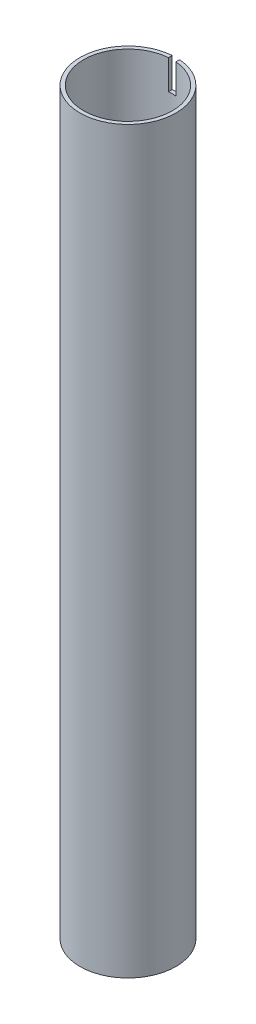
ISO-10303-21;
HEADER;
FILE_DESCRIPTION(('STEP AP214'),'2;1');
FILE_NAME('part.step','',(''),(''),'','','');
FILE_SCHEMA(('AUTOMOTIVE_DESIGN { 1 0 10303 214 1 1 1 1 }'));
ENDSEC;
DATA;
#1=APPLICATION_CONTEXT('core data for automotive mechanical design processes');
#2=APPLICATION_PROTOCOL_DEFINITION('international standard','automotive_design',2000,#1);
#3=PRODUCT_CONTEXT('',#1,'mechanical');
#4=PRODUCT('Part','Part','',(#3));
#5=PRODUCT_RELATED_PRODUCT_CATEGORY('part','',(#4));
#6=PRODUCT_DEFINITION_FORMATION('','',#4);
#7=PRODUCT_DEFINITION_CONTEXT('part definition',#1,'design');
#8=PRODUCT_DEFINITION('design','',#6,#7);
#9=PRODUCT_DEFINITION_SHAPE('','',#8);
#10=(LENGTH_UNIT() NAMED_UNIT(*) SI_UNIT(.MILLI.,.METRE.));
#11=(NAMED_UNIT(*) PLANE_ANGLE_UNIT() SI_UNIT($,.RADIAN.));
#12=(NAMED_UNIT(*) SI_UNIT($,.STERADIAN.) SOLID_ANGLE_UNIT());
#13=UNCERTAINTY_MEASURE_WITH_UNIT(LENGTH_MEASURE(1.E-05),#10,'distance_accuracy_value','');
#14=(GEOMETRIC_REPRESENTATION_CONTEXT(3) GLOBAL_UNCERTAINTY_ASSIGNED_CONTEXT((#13)) GLOBAL_UNIT_ASSIGNED_CONTEXT((#10,
#11,#12)) REPRESENTATION_CONTEXT('',''));
#15=CARTESIAN_POINT('',(0.,0.,0.));
#16=DIRECTION('',(0.,0.,1.));
#17=DIRECTION('',(1.,0.,0.));
#18=AXIS2_PLACEMENT_3D('',#15,#16,#17);
#19=CARTESIAN_POINT('',(0.,250.,0.));
#20=DIRECTION('',(0.,1.,0.));
#21=DIRECTION('',(0.,0.,1.));
#22=AXIS2_PLACEMENT_3D('',#19,#20,#21);
#23=PLANE('',#22);
#24=DIRECTION('',(0.,0.,1.));
#25=VECTOR('',#24,1.);
#26=CARTESIAN_POINT('',(2.49999999999996,250.,-32.501));
#27=LINE('',#26,#25);
#28=CARTESIAN_POINT('',(2.49999999999996,250.,-32.4037034920393));
#29=VERTEX_POINT('',#28);
#30=CARTESIAN_POINT('',(2.49999999999996,250.,-29.8956518577535));
#31=VERTEX_POINT('',#30);
#32=EDGE_CURVE('E137',#29,#31,#27,.T.);
#33=ORIENTED_EDGE('',*,*,#32,.T.);
#34=CARTESIAN_POINT('',(0.,250.,0.));
#35=DIRECTION('',(0.,1.,0.));
#36=DIRECTION('',(0.,0.,1.));
#37=AXIS2_PLACEMENT_3D('',#34,#35,#36);
#38=CIRCLE('',#37,30.);
#39=CARTESIAN_POINT('',(-2.50000000000004,250.,-29.8956518577535));
#40=VERTEX_POINT('',#39);
#41=EDGE_CURVE('E143',#40,#31,#38,.T.);
#42=ORIENTED_EDGE('',*,*,#41,.F.);
#43=DIRECTION('',(0.,0.,1.));
#44=VECTOR('',#43,1.);
#45=CARTESIAN_POINT('',(-2.50000000000004,250.,-32.501));
#46=LINE('',#45,#44);
#47=CARTESIAN_POINT('',(-2.50000000000004,250.,-32.4037034920393));
#48=VERTEX_POINT('',#47);
#49=EDGE_CURVE('E55',#48,#40,#46,.T.);
#50=ORIENTED_EDGE('',*,*,#49,.F.);
#51=CARTESIAN_POINT('',(0.,250.,0.));
#52=DIRECTION('',(0.,1.,0.));
#53=DIRECTION('',(0.,0.,1.));
#54=AXIS2_PLACEMENT_3D('',#51,#52,#53);
#55=CIRCLE('',#54,32.5);
#56=EDGE_CURVE('E149',#48,#29,#55,.T.);
#57=ORIENTED_EDGE('',*,*,#56,.T.);
#58=EDGE_LOOP('',(#33,#42,#50,#57));
#59=FACE_BOUND('',#58,.T.);
#60=ADVANCED_FACE('F33',(#59),#23,.T.);
#61=CARTESIAN_POINT('',(0.,-250.,0.));
#62=DIRECTION('',(0.,1.,0.));
#63=DIRECTION('',(0.,0.,1.));
#64=AXIS2_PLACEMENT_3D('',#61,#62,#63);
#65=PLANE('',#64);
#66=CARTESIAN_POINT('',(0.,-250.,0.));
#67=DIRECTION('',(0.,1.,0.));
#68=DIRECTION('',(0.,0.,1.));
#69=AXIS2_PLACEMENT_3D('',#66,#67,#68);
#70=CIRCLE('',#69,30.);
#71=CARTESIAN_POINT('',(-2.49999999999995,-250.,-29.8956518577535));
#72=VERTEX_POINT('',#71);
#73=CARTESIAN_POINT('',(2.50000000000005,-250.,-29.8956518577535));
#74=VERTEX_POINT('',#73);
#75=EDGE_CURVE('E114',#72,#74,#70,.T.);
#76=ORIENTED_EDGE('',*,*,#75,.T.);
#77=DIRECTION('',(0.,0.,1.));
#78=VECTOR('',#77,1.);
#79=CARTESIAN_POINT('',(2.50000000000005,-250.,-32.501));
#80=LINE('',#79,#78);
#81=CARTESIAN_POINT('',(2.50000000000005,-250.,-32.4037034920393));
#82=VERTEX_POINT('',#81);
#83=EDGE_CURVE('E121',#82,#74,#80,.T.);
#84=ORIENTED_EDGE('',*,*,#83,.F.);
#85=CARTESIAN_POINT('',(0.,-250.,0.));
#86=DIRECTION('',(0.,1.,0.));
#87=DIRECTION('',(0.,0.,1.));
#88=AXIS2_PLACEMENT_3D('',#85,#86,#87);
#89=CIRCLE('',#88,32.5);
#90=CARTESIAN_POINT('',(-2.49999999999995,-250.,-32.4037034920393));
#91=VERTEX_POINT('',#90);
#92=EDGE_CURVE('E146',#91,#82,#89,.T.);
#93=ORIENTED_EDGE('',*,*,#92,.F.);
#94=DIRECTION('',(0.,0.,1.));
#95=VECTOR('',#94,1.);
#96=CARTESIAN_POINT('',(-2.49999999999995,-250.,-32.501));
#97=LINE('',#96,#95);
#98=EDGE_CURVE('E105',#91,#72,#97,.T.);
#99=ORIENTED_EDGE('',*,*,#98,.T.);
#100=EDGE_LOOP('',(#76,#84,#93,#99));
#101=FACE_BOUND('',#100,.T.);
#102=ADVANCED_FACE('F162',(#101),#65,.F.);
#103=CARTESIAN_POINT('',(0.,250.,0.));
#104=DIRECTION('',(0.,-1.,0.));
#105=DIRECTION('',(0.,0.,-1.));
#106=AXIS2_PLACEMENT_3D('',#103,#104,#105);
#107=CYLINDRICAL_SURFACE('',#106,32.5);
#108=ORIENTED_EDGE('',*,*,#92,.T.);
#109=DIRECTION('',(0.,-1.,0.));
#110=VECTOR('',#109,1.);
#111=CARTESIAN_POINT('',(2.50000000000005,250.,-32.4037034920393));
#112=LINE('',#111,#110);
#113=CARTESIAN_POINT('',(2.50000000000005,-230.,-32.4037034920393));
#114=VERTEX_POINT('',#113);
#115=EDGE_CURVE('E115',#114,#82,#112,.T.);
#116=ORIENTED_EDGE('',*,*,#115,.F.);
#117=CARTESIAN_POINT('',(0.,-230.,0.));
#118=DIRECTION('',(0.,1.,0.));
#119=DIRECTION('',(0.,0.,1.));
#120=AXIS2_PLACEMENT_3D('',#117,#118,#119);
#121=CIRCLE('',#120,32.5);
#122=CARTESIAN_POINT('',(-2.49999999999995,-230.,-32.4037034920393));
#123=VERTEX_POINT('',#122);
#124=EDGE_CURVE('E99',#123,#114,#121,.F.);
#125=ORIENTED_EDGE('',*,*,#124,.F.);
#126=DIRECTION('',(0.,-1.,0.));
#127=VECTOR('',#126,1.);
#128=CARTESIAN_POINT('',(-2.49999999999995,250.,-32.4037034920393));
#129=LINE('',#128,#127);
#130=EDGE_CURVE('E108',#91,#123,#129,.F.);
#131=ORIENTED_EDGE('',*,*,#130,.F.);
#132=EDGE_LOOP('',(#108,#116,#125,#131));
#133=FACE_BOUND('',#132,.T.);
#134=CARTESIAN_POINT('',(0.,230.,0.));
#135=DIRECTION('',(0.,-1.,0.));
#136=DIRECTION('',(0.,0.,-1.));
#137=AXIS2_PLACEMENT_3D('',#134,#135,#136);
#138=CIRCLE('',#137,32.5);
#139=CARTESIAN_POINT('',(2.49999999999996,230.,-32.4037034920393));
#140=VERTEX_POINT('',#139);
#141=CARTESIAN_POINT('',(-2.50000000000004,230.,-32.4037034920393));
#142=VERTEX_POINT('',#141);
#143=EDGE_CURVE('E127',#140,#142,#138,.F.);
#144=ORIENTED_EDGE('',*,*,#143,.F.);
#145=DIRECTION('',(0.,-1.,0.));
#146=VECTOR('',#145,1.);
#147=CARTESIAN_POINT('',(2.49999999999996,250.,-32.4037034920393));
#148=LINE('',#147,#146);
#149=EDGE_CURVE('E130',#29,#140,#148,.T.);
#150=ORIENTED_EDGE('',*,*,#149,.F.);
#151=ORIENTED_EDGE('',*,*,#56,.F.);
#152=DIRECTION('',(0.,-1.,0.));
#153=VECTOR('',#152,1.);
#154=CARTESIAN_POINT('',(-2.50000000000004,250.,-32.4037034920393));
#155=LINE('',#154,#153);
#156=EDGE_CURVE('E125',#142,#48,#155,.F.);
#157=ORIENTED_EDGE('',*,*,#156,.F.);
#158=EDGE_LOOP('',(#144,#150,#151,#157));
#159=FACE_BOUND('',#158,.T.);
#160=ADVANCED_FACE('F35',(#133,#159),#107,.T.);
#161=CARTESIAN_POINT('',(0.,250.,0.));
#162=DIRECTION('',(0.,-1.,0.));
#163=DIRECTION('',(0.,0.,-1.));
#164=AXIS2_PLACEMENT_3D('',#161,#162,#163);
#165=CYLINDRICAL_SURFACE('',#164,30.);
#166=DIRECTION('',(0.,-1.,0.));
#167=VECTOR('',#166,1.);
#168=CARTESIAN_POINT('',(2.50000000000005,250.,-29.8956518577535));
#169=LINE('',#168,#167);
#170=CARTESIAN_POINT('',(2.50000000000005,-230.,-29.8956518577535));
#171=VERTEX_POINT('',#170);
#172=EDGE_CURVE('E11',#74,#171,#169,.F.);
#173=ORIENTED_EDGE('',*,*,#172,.F.);
#174=ORIENTED_EDGE('',*,*,#75,.F.);
#175=DIRECTION('',(0.,-1.,0.));
#176=VECTOR('',#175,1.);
#177=CARTESIAN_POINT('',(-2.49999999999995,250.,-29.8956518577535));
#178=LINE('',#177,#176);
#179=CARTESIAN_POINT('',(-2.49999999999995,-230.,-29.8956518577535));
#180=VERTEX_POINT('',#179);
#181=EDGE_CURVE('E41',#180,#72,#178,.T.);
#182=ORIENTED_EDGE('',*,*,#181,.F.);
#183=CARTESIAN_POINT('',(0.,-230.,0.));
#184=DIRECTION('',(0.,1.,0.));
#185=DIRECTION('',(0.,0.,1.));
#186=AXIS2_PLACEMENT_3D('',#183,#184,#185);
#187=CIRCLE('',#186,30.);
#188=EDGE_CURVE('E102',#171,#180,#187,.T.);
#189=ORIENTED_EDGE('',*,*,#188,.F.);
#190=EDGE_LOOP('',(#173,#174,#182,#189));
#191=FACE_BOUND('',#190,.T.);
#192=DIRECTION('',(0.,-1.,0.));
#193=VECTOR('',#192,1.);
#194=CARTESIAN_POINT('',(2.49999999999996,250.,-29.8956518577535));
#195=LINE('',#194,#193);
#196=CARTESIAN_POINT('',(2.49999999999996,230.,-29.8956518577535));
#197=VERTEX_POINT('',#196);
#198=EDGE_CURVE('E157',#197,#31,#195,.F.);
#199=ORIENTED_EDGE('',*,*,#198,.F.);
#200=CARTESIAN_POINT('',(0.,230.,0.));
#201=DIRECTION('',(0.,-1.,0.));
#202=DIRECTION('',(0.,0.,-1.));
#203=AXIS2_PLACEMENT_3D('',#200,#201,#202);
#204=CIRCLE('',#203,30.);
#205=CARTESIAN_POINT('',(-2.50000000000004,230.,-29.8956518577535));
#206=VERTEX_POINT('',#205);
#207=EDGE_CURVE('E155',#206,#197,#204,.T.);
#208=ORIENTED_EDGE('',*,*,#207,.F.);
#209=DIRECTION('',(0.,-1.,0.));
#210=VECTOR('',#209,1.);
#211=CARTESIAN_POINT('',(-2.50000000000004,250.,-29.8956518577535));
#212=LINE('',#211,#210);
#213=EDGE_CURVE('E152',#40,#206,#212,.T.);
#214=ORIENTED_EDGE('',*,*,#213,.F.);
#215=ORIENTED_EDGE('',*,*,#41,.T.);
#216=EDGE_LOOP('',(#199,#208,#214,#215));
#217=FACE_BOUND('',#216,.T.);
#218=ADVANCED_FACE('F165',(#191,#217),#165,.F.);
#219=CARTESIAN_POINT('',(2.49999999999996,230.,-32.501));
#220=DIRECTION('',(1.,0.,0.));
#221=DIRECTION('',(0.,0.,-1.));
#222=AXIS2_PLACEMENT_3D('',#219,#220,#221);
#223=PLANE('',#222);
#224=ORIENTED_EDGE('',*,*,#198,.T.);
#225=ORIENTED_EDGE('',*,*,#32,.F.);
#226=ORIENTED_EDGE('',*,*,#149,.T.);
#227=DIRECTION('',(0.,0.,1.));
#228=VECTOR('',#227,1.);
#229=CARTESIAN_POINT('',(2.49999999999996,230.,-32.501));
#230=LINE('',#229,#228);
#231=EDGE_CURVE('E133',#140,#197,#230,.T.);
#232=ORIENTED_EDGE('',*,*,#231,.T.);
#233=EDGE_LOOP('',(#224,#225,#226,#232));
#234=FACE_BOUND('',#233,.T.);
#235=ADVANCED_FACE('F188',(#234),#223,.F.);
#236=CARTESIAN_POINT('',(-2.50000000000004,230.,-32.501));
#237=DIRECTION('',(0.,-1.,0.));
#238=DIRECTION('',(0.,0.,-1.));
#239=AXIS2_PLACEMENT_3D('',#236,#237,#238);
#240=PLANE('',#239);
#241=ORIENTED_EDGE('',*,*,#207,.T.);
#242=ORIENTED_EDGE('',*,*,#231,.F.);
#243=ORIENTED_EDGE('',*,*,#143,.T.);
#244=DIRECTION('',(0.,0.,1.));
#245=VECTOR('',#244,1.);
#246=CARTESIAN_POINT('',(-2.50000000000004,230.,-32.501));
#247=LINE('',#246,#245);
#248=EDGE_CURVE('E136',#142,#206,#247,.T.);
#249=ORIENTED_EDGE('',*,*,#248,.T.);
#250=EDGE_LOOP('',(#241,#242,#243,#249));
#251=FACE_BOUND('',#250,.T.);
#252=ADVANCED_FACE('F177',(#251),#240,.F.);
#253=CARTESIAN_POINT('',(-2.50000000000004,230.,-32.501));
#254=DIRECTION('',(-1.,0.,0.));
#255=DIRECTION('',(0.,0.,1.));
#256=AXIS2_PLACEMENT_3D('',#253,#254,#255);
#257=PLANE('',#256);
#258=ORIENTED_EDGE('',*,*,#213,.T.);
#259=ORIENTED_EDGE('',*,*,#248,.F.);
#260=ORIENTED_EDGE('',*,*,#156,.T.);
#261=ORIENTED_EDGE('',*,*,#49,.T.);
#262=EDGE_LOOP('',(#258,#259,#260,#261));
#263=FACE_BOUND('',#262,.T.);
#264=ADVANCED_FACE('F170',(#263),#257,.F.);
#265=CARTESIAN_POINT('',(2.50000000000005,-250.,-32.501));
#266=DIRECTION('',(1.,0.,0.));
#267=DIRECTION('',(0.,0.,-1.));
#268=AXIS2_PLACEMENT_3D('',#265,#266,#267);
#269=PLANE('',#268);
#270=ORIENTED_EDGE('',*,*,#172,.T.);
#271=DIRECTION('',(0.,0.,1.));
#272=VECTOR('',#271,1.);
#273=CARTESIAN_POINT('',(2.50000000000005,-230.,-32.501));
#274=LINE('',#273,#272);
#275=EDGE_CURVE('E48',#114,#171,#274,.T.);
#276=ORIENTED_EDGE('',*,*,#275,.F.);
#277=ORIENTED_EDGE('',*,*,#115,.T.);
#278=ORIENTED_EDGE('',*,*,#83,.T.);
#279=EDGE_LOOP('',(#270,#276,#277,#278));
#280=FACE_BOUND('',#279,.T.);
#281=ADVANCED_FACE('F168',(#280),#269,.F.);
#282=CARTESIAN_POINT('',(-2.49999999999995,-250.,-32.501));
#283=DIRECTION('',(-1.,0.,0.));
#284=DIRECTION('',(0.,0.,1.));
#285=AXIS2_PLACEMENT_3D('',#282,#283,#284);
#286=PLANE('',#285);
#287=ORIENTED_EDGE('',*,*,#181,.T.);
#288=ORIENTED_EDGE('',*,*,#98,.F.);
#289=ORIENTED_EDGE('',*,*,#130,.T.);
#290=DIRECTION('',(0.,0.,1.));
#291=VECTOR('',#290,1.);
#292=CARTESIAN_POINT('',(-2.49999999999995,-230.,-32.501));
#293=LINE('',#292,#291);
#294=EDGE_CURVE('E95',#123,#180,#293,.T.);
#295=ORIENTED_EDGE('',*,*,#294,.T.);
#296=EDGE_LOOP('',(#287,#288,#289,#295));
#297=FACE_BOUND('',#296,.T.);
#298=ADVANCED_FACE('F109',(#297),#286,.F.);
#299=CARTESIAN_POINT('',(-2.49999999999995,-230.,-32.501));
#300=DIRECTION('',(0.,1.,0.));
#301=DIRECTION('',(0.,0.,1.));
#302=AXIS2_PLACEMENT_3D('',#299,#300,#301);
#303=PLANE('',#302);
#304=ORIENTED_EDGE('',*,*,#188,.T.);
#305=ORIENTED_EDGE('',*,*,#294,.F.);
#306=ORIENTED_EDGE('',*,*,#124,.T.);
#307=ORIENTED_EDGE('',*,*,#275,.T.);
#308=EDGE_LOOP('',(#304,#305,#306,#307));
#309=FACE_BOUND('',#308,.T.);
#310=ADVANCED_FACE('F97',(#309),#303,.F.);
#311=CLOSED_SHELL('',(#60,#102,#160,#218,#235,#252,#264,#281,#298,#310));
#312=MANIFOLD_SOLID_BREP('B2',#311);
#313=ADVANCED_BREP_SHAPE_REPRESENTATION('',(#18,#312),#14);
#314=SHAPE_DEFINITION_REPRESENTATION(#9,#313);
ENDSEC;
END-ISO-10303-21;
